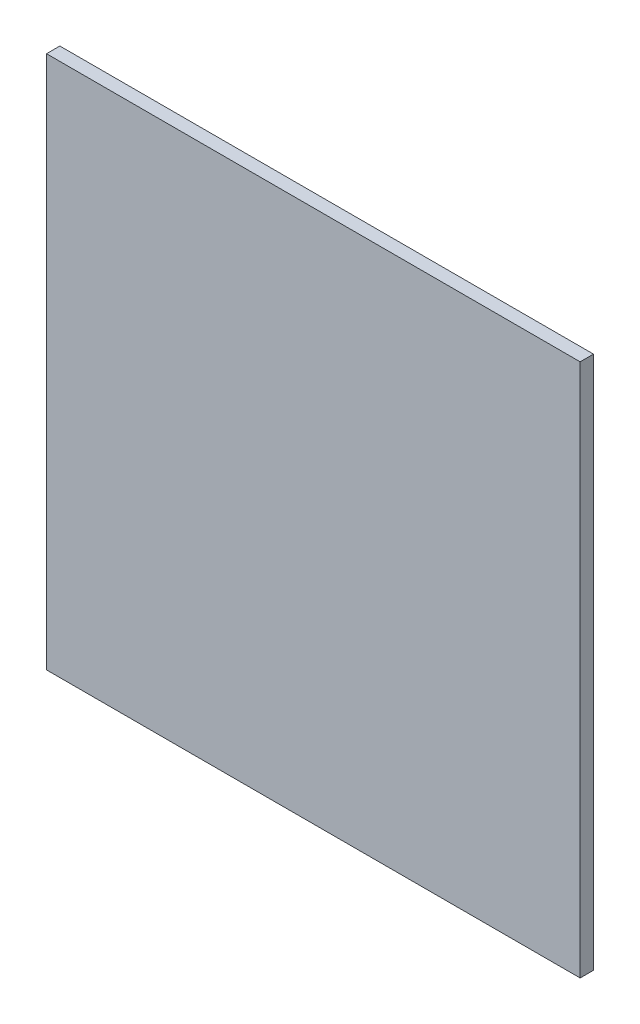
ISO-10303-21;
HEADER;
FILE_DESCRIPTION(('STEP AP214'),'2;1');
FILE_NAME('part.step','',(''),(''),'','','');
FILE_SCHEMA(('AUTOMOTIVE_DESIGN { 1 0 10303 214 1 1 1 1 }'));
ENDSEC;
DATA;
#1=APPLICATION_CONTEXT('core data for automotive mechanical design processes');
#2=APPLICATION_PROTOCOL_DEFINITION('international standard','automotive_design',2000,#1);
#3=PRODUCT_CONTEXT('',#1,'mechanical');
#4=PRODUCT('Part','Part','',(#3));
#5=PRODUCT_RELATED_PRODUCT_CATEGORY('part','',(#4));
#6=PRODUCT_DEFINITION_FORMATION('','',#4);
#7=PRODUCT_DEFINITION_CONTEXT('part definition',#1,'design');
#8=PRODUCT_DEFINITION('design','',#6,#7);
#9=PRODUCT_DEFINITION_SHAPE('','',#8);
#10=(LENGTH_UNIT() NAMED_UNIT(*) SI_UNIT(.MILLI.,.METRE.));
#11=(NAMED_UNIT(*) PLANE_ANGLE_UNIT() SI_UNIT($,.RADIAN.));
#12=(NAMED_UNIT(*) SI_UNIT($,.STERADIAN.) SOLID_ANGLE_UNIT());
#13=UNCERTAINTY_MEASURE_WITH_UNIT(LENGTH_MEASURE(1.E-05),#10,'distance_accuracy_value','');
#14=(GEOMETRIC_REPRESENTATION_CONTEXT(3) GLOBAL_UNCERTAINTY_ASSIGNED_CONTEXT((#13)) GLOBAL_UNIT_ASSIGNED_CONTEXT((#10,
#11,#12)) REPRESENTATION_CONTEXT('',''));
#15=CARTESIAN_POINT('',(0.,0.,0.));
#16=DIRECTION('',(0.,0.,1.));
#17=DIRECTION('',(1.,0.,0.));
#18=AXIS2_PLACEMENT_3D('',#15,#16,#17);
#19=CARTESIAN_POINT('',(0.,0.,2.5));
#20=DIRECTION('',(-1.,0.,0.));
#21=DIRECTION('',(0.,0.,1.));
#22=AXIS2_PLACEMENT_3D('',#19,#20,#21);
#23=PLANE('',#22);
#24=DIRECTION('',(0.,1.,0.));
#25=VECTOR('',#24,1.);
#26=CARTESIAN_POINT('',(0.,0.,0.));
#27=LINE('',#26,#25);
#28=CARTESIAN_POINT('',(0.,0.,0.));
#29=VERTEX_POINT('',#28);
#30=CARTESIAN_POINT('',(0.,100.,0.));
#31=VERTEX_POINT('',#30);
#32=EDGE_CURVE('E100',#29,#31,#27,.T.);
#33=ORIENTED_EDGE('',*,*,#32,.F.);
#34=DIRECTION('',(0.,0.,-1.));
#35=VECTOR('',#34,1.);
#36=CARTESIAN_POINT('',(0.,0.,2.5));
#37=LINE('',#36,#35);
#38=CARTESIAN_POINT('',(0.,0.,2.5));
#39=VERTEX_POINT('',#38);
#40=EDGE_CURVE('E11',#39,#29,#37,.T.);
#41=ORIENTED_EDGE('',*,*,#40,.F.);
#42=DIRECTION('',(0.,1.,0.));
#43=VECTOR('',#42,1.);
#44=CARTESIAN_POINT('',(0.,0.,2.5));
#45=LINE('',#44,#43);
#46=CARTESIAN_POINT('',(0.,100.,2.5));
#47=VERTEX_POINT('',#46);
#48=EDGE_CURVE('E95',#39,#47,#45,.T.);
#49=ORIENTED_EDGE('',*,*,#48,.T.);
#50=DIRECTION('',(0.,0.,-1.));
#51=VECTOR('',#50,1.);
#52=CARTESIAN_POINT('',(0.,100.,2.5));
#53=LINE('',#52,#51);
#54=EDGE_CURVE('E38',#47,#31,#53,.T.);
#55=ORIENTED_EDGE('',*,*,#54,.T.);
#56=EDGE_LOOP('',(#33,#41,#49,#55));
#57=FACE_BOUND('',#56,.T.);
#58=ADVANCED_FACE('F35',(#57),#23,.T.);
#59=CARTESIAN_POINT('',(0.,0.,2.5));
#60=DIRECTION('',(0.,1.,0.));
#61=DIRECTION('',(0.,0.,1.));
#62=AXIS2_PLACEMENT_3D('',#59,#60,#61);
#63=PLANE('',#62);
#64=DIRECTION('',(1.,0.,0.));
#65=VECTOR('',#64,1.);
#66=CARTESIAN_POINT('',(0.,0.,0.));
#67=LINE('',#66,#65);
#68=CARTESIAN_POINT('',(100.,0.,0.));
#69=VERTEX_POINT('',#68);
#70=EDGE_CURVE('E68',#29,#69,#67,.T.);
#71=ORIENTED_EDGE('',*,*,#70,.T.);
#72=DIRECTION('',(0.,0.,-1.));
#73=VECTOR('',#72,1.);
#74=CARTESIAN_POINT('',(100.,0.,2.5));
#75=LINE('',#74,#73);
#76=CARTESIAN_POINT('',(100.,0.,2.5));
#77=VERTEX_POINT('',#76);
#78=EDGE_CURVE('E44',#77,#69,#75,.T.);
#79=ORIENTED_EDGE('',*,*,#78,.F.);
#80=DIRECTION('',(1.,0.,0.));
#81=VECTOR('',#80,1.);
#82=CARTESIAN_POINT('',(0.,0.,2.5));
#83=LINE('',#82,#81);
#84=EDGE_CURVE('E85',#39,#77,#83,.T.);
#85=ORIENTED_EDGE('',*,*,#84,.F.);
#86=ORIENTED_EDGE('',*,*,#40,.T.);
#87=EDGE_LOOP('',(#71,#79,#85,#86));
#88=FACE_BOUND('',#87,.T.);
#89=ADVANCED_FACE('F110',(#88),#63,.F.);
#90=CARTESIAN_POINT('',(100.,0.,2.5));
#91=DIRECTION('',(-1.,0.,0.));
#92=DIRECTION('',(0.,0.,1.));
#93=AXIS2_PLACEMENT_3D('',#90,#91,#92);
#94=PLANE('',#93);
#95=DIRECTION('',(0.,1.,0.));
#96=VECTOR('',#95,1.);
#97=CARTESIAN_POINT('',(100.,0.,0.));
#98=LINE('',#97,#96);
#99=CARTESIAN_POINT('',(100.,100.,0.));
#100=VERTEX_POINT('',#99);
#101=EDGE_CURVE('E92',#69,#100,#98,.T.);
#102=ORIENTED_EDGE('',*,*,#101,.T.);
#103=DIRECTION('',(0.,0.,-1.));
#104=VECTOR('',#103,1.);
#105=CARTESIAN_POINT('',(100.,100.,2.5));
#106=LINE('',#105,#104);
#107=CARTESIAN_POINT('',(100.,100.,2.5));
#108=VERTEX_POINT('',#107);
#109=EDGE_CURVE('E89',#108,#100,#106,.T.);
#110=ORIENTED_EDGE('',*,*,#109,.F.);
#111=DIRECTION('',(0.,1.,0.));
#112=VECTOR('',#111,1.);
#113=CARTESIAN_POINT('',(100.,0.,2.5));
#114=LINE('',#113,#112);
#115=EDGE_CURVE('E80',#77,#108,#114,.T.);
#116=ORIENTED_EDGE('',*,*,#115,.F.);
#117=ORIENTED_EDGE('',*,*,#78,.T.);
#118=EDGE_LOOP('',(#102,#110,#116,#117));
#119=FACE_BOUND('',#118,.T.);
#120=ADVANCED_FACE('F90',(#119),#94,.F.);
#121=CARTESIAN_POINT('',(0.,100.,2.5));
#122=DIRECTION('',(0.,1.,0.));
#123=DIRECTION('',(0.,0.,1.));
#124=AXIS2_PLACEMENT_3D('',#121,#122,#123);
#125=PLANE('',#124);
#126=DIRECTION('',(1.,0.,0.));
#127=VECTOR('',#126,1.);
#128=CARTESIAN_POINT('',(0.,100.,0.));
#129=LINE('',#128,#127);
#130=EDGE_CURVE('E103',#31,#100,#129,.T.);
#131=ORIENTED_EDGE('',*,*,#130,.F.);
#132=ORIENTED_EDGE('',*,*,#54,.F.);
#133=DIRECTION('',(1.,0.,0.));
#134=VECTOR('',#133,1.);
#135=CARTESIAN_POINT('',(0.,100.,2.5));
#136=LINE('',#135,#134);
#137=EDGE_CURVE('E84',#47,#108,#136,.T.);
#138=ORIENTED_EDGE('',*,*,#137,.T.);
#139=ORIENTED_EDGE('',*,*,#109,.T.);
#140=EDGE_LOOP('',(#131,#132,#138,#139));
#141=FACE_BOUND('',#140,.T.);
#142=ADVANCED_FACE('F94',(#141),#125,.T.);
#143=CARTESIAN_POINT('',(0.,0.,2.5));
#144=DIRECTION('',(0.,0.,-1.));
#145=DIRECTION('',(-1.,0.,0.));
#146=AXIS2_PLACEMENT_3D('',#143,#144,#145);
#147=PLANE('',#146);
#148=ORIENTED_EDGE('',*,*,#48,.F.);
#149=ORIENTED_EDGE('',*,*,#84,.T.);
#150=ORIENTED_EDGE('',*,*,#115,.T.);
#151=ORIENTED_EDGE('',*,*,#137,.F.);
#152=EDGE_LOOP('',(#148,#149,#150,#151));
#153=FACE_BOUND('',#152,.T.);
#154=ADVANCED_FACE('F83',(#153),#147,.F.);
#155=CARTESIAN_POINT('',(0.,0.,0.));
#156=DIRECTION('',(0.,0.,-1.));
#157=DIRECTION('',(-1.,0.,0.));
#158=AXIS2_PLACEMENT_3D('',#155,#156,#157);
#159=PLANE('',#158);
#160=ORIENTED_EDGE('',*,*,#32,.T.);
#161=ORIENTED_EDGE('',*,*,#130,.T.);
#162=ORIENTED_EDGE('',*,*,#101,.F.);
#163=ORIENTED_EDGE('',*,*,#70,.F.);
#164=EDGE_LOOP('',(#160,#161,#162,#163));
#165=FACE_BOUND('',#164,.T.);
#166=ADVANCED_FACE('F108',(#165),#159,.T.);
#167=CLOSED_SHELL('',(#58,#89,#120,#142,#154,#166));
#168=MANIFOLD_SOLID_BREP('B2',#167);
#169=ADVANCED_BREP_SHAPE_REPRESENTATION('',(#18,#168),#14);
#170=SHAPE_DEFINITION_REPRESENTATION(#9,#169);
ENDSEC;
END-ISO-10303-21;
